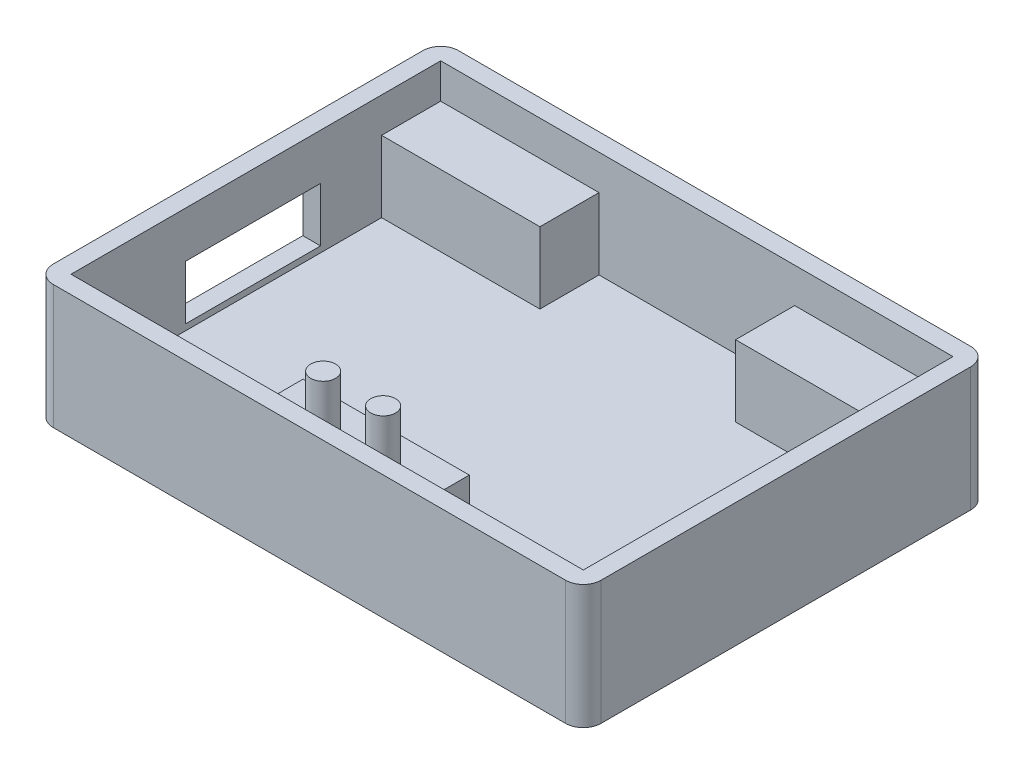
ISO-10303-21;
HEADER;
FILE_DESCRIPTION(('STEP AP214'),'2;1');
FILE_NAME('part.step','',(''),(''),'','','');
FILE_SCHEMA(('AUTOMOTIVE_DESIGN { 1 0 10303 214 1 1 1 1 }'));
ENDSEC;
DATA;
#1=APPLICATION_CONTEXT('core data for automotive mechanical design processes');
#2=APPLICATION_PROTOCOL_DEFINITION('international standard','automotive_design',2000,#1);
#3=PRODUCT_CONTEXT('',#1,'mechanical');
#4=PRODUCT('Part','Part','',(#3));
#5=PRODUCT_RELATED_PRODUCT_CATEGORY('part','',(#4));
#6=PRODUCT_DEFINITION_FORMATION('','',#4);
#7=PRODUCT_DEFINITION_CONTEXT('part definition',#1,'design');
#8=PRODUCT_DEFINITION('design','',#6,#7);
#9=PRODUCT_DEFINITION_SHAPE('','',#8);
#10=(LENGTH_UNIT() NAMED_UNIT(*) SI_UNIT(.MILLI.,.METRE.));
#11=(NAMED_UNIT(*) PLANE_ANGLE_UNIT() SI_UNIT($,.RADIAN.));
#12=(NAMED_UNIT(*) SI_UNIT($,.STERADIAN.) SOLID_ANGLE_UNIT());
#13=UNCERTAINTY_MEASURE_WITH_UNIT(LENGTH_MEASURE(1.E-05),#10,'distance_accuracy_value','');
#14=(GEOMETRIC_REPRESENTATION_CONTEXT(3) GLOBAL_UNCERTAINTY_ASSIGNED_CONTEXT((#13)) GLOBAL_UNIT_ASSIGNED_CONTEXT((#10,
#11,#12)) REPRESENTATION_CONTEXT('',''));
#15=CARTESIAN_POINT('',(0.,0.,0.));
#16=DIRECTION('',(0.,0.,1.));
#17=DIRECTION('',(1.,0.,0.));
#18=AXIS2_PLACEMENT_3D('',#15,#16,#17);
#19=CARTESIAN_POINT('',(0.,17.78,26.7452691548168));
#20=DIRECTION('',(0.,0.,-1.));
#21=DIRECTION('',(-1.,0.,0.));
#22=AXIS2_PLACEMENT_3D('',#19,#20,#21);
#23=PLANE('',#22);
#24=DIRECTION('',(1.,0.,0.));
#25=VECTOR('',#24,1.);
#26=CARTESIAN_POINT('',(0.,2.54,26.7452691548168));
#27=LINE('',#26,#25);
#28=CARTESIAN_POINT('',(11.6490516093158,2.54,26.7452691548168));
#29=VERTEX_POINT('',#28);
#30=CARTESIAN_POINT('',(36.6268923380733,2.54,26.7452691548168));
#31=VERTEX_POINT('',#30);
#32=EDGE_CURVE('E505',#29,#31,#27,.T.);
#33=ORIENTED_EDGE('',*,*,#32,.F.);
#34=DIRECTION('',(0.,-1.,0.));
#35=VECTOR('',#34,1.);
#36=CARTESIAN_POINT('',(11.6490516093158,12.7635,26.7452691548168));
#37=LINE('',#36,#35);
#38=CARTESIAN_POINT('',(11.6490516093158,12.7635,26.7452691548168));
#39=VERTEX_POINT('',#38);
#40=EDGE_CURVE('E358',#39,#29,#37,.T.);
#41=ORIENTED_EDGE('',*,*,#40,.F.);
#42=DIRECTION('',(1.,0.,0.));
#43=VECTOR('',#42,1.);
#44=CARTESIAN_POINT('',(0.,12.7635,26.7452691548168));
#45=LINE('',#44,#43);
#46=CARTESIAN_POINT('',(-12.1761728281339,12.7635,26.7452691548168));
#47=VERTEX_POINT('',#46);
#48=EDGE_CURVE('E384',#47,#39,#45,.T.);
#49=ORIENTED_EDGE('',*,*,#48,.F.);
#50=DIRECTION('',(0.,-1.,0.));
#51=VECTOR('',#50,1.);
#52=CARTESIAN_POINT('',(-12.1761728281339,12.7635,26.7452691548168));
#53=LINE('',#52,#51);
#54=CARTESIAN_POINT('',(-12.1761728281339,2.54,26.7452691548168));
#55=VERTEX_POINT('',#54);
#56=EDGE_CURVE('E370',#47,#55,#53,.T.);
#57=ORIENTED_EDGE('',*,*,#56,.T.);
#58=CARTESIAN_POINT('',(-36.8231076619268,2.54,26.7452691548168));
#59=VERTEX_POINT('',#58);
#60=EDGE_CURVE('E509',#59,#55,#27,.T.);
#61=ORIENTED_EDGE('',*,*,#60,.F.);
#62=DIRECTION('',(0.,-1.,0.));
#63=VECTOR('',#62,1.);
#64=CARTESIAN_POINT('',(-36.8231076619268,17.78,26.7452691548168));
#65=LINE('',#64,#63);
#66=CARTESIAN_POINT('',(-36.8231076619268,17.78,26.7452691548168));
#67=VERTEX_POINT('',#66);
#68=EDGE_CURVE('E493',#67,#59,#65,.T.);
#69=ORIENTED_EDGE('',*,*,#68,.F.);
#70=DIRECTION('',(1.,0.,0.));
#71=VECTOR('',#70,1.);
#72=CARTESIAN_POINT('',(0.,17.78,26.7452691548168));
#73=LINE('',#72,#71);
#74=CARTESIAN_POINT('',(36.6268923380733,17.78,26.7452691548168));
#75=VERTEX_POINT('',#74);
#76=EDGE_CURVE('E445',#67,#75,#73,.T.);
#77=ORIENTED_EDGE('',*,*,#76,.T.);
#78=DIRECTION('',(0.,-1.,0.));
#79=VECTOR('',#78,1.);
#80=CARTESIAN_POINT('',(36.6268923380733,17.78,26.7452691548168));
#81=LINE('',#80,#79);
#82=EDGE_CURVE('E497',#75,#31,#81,.T.);
#83=ORIENTED_EDGE('',*,*,#82,.T.);
#84=EDGE_LOOP('',(#33,#41,#49,#57,#61,#69,#77,#83));
#85=FACE_BOUND('',#84,.T.);
#86=ADVANCED_FACE('F118',(#85),#23,.T.);
#87=CARTESIAN_POINT('',(-36.8231076619268,17.78,0.));
#88=DIRECTION('',(1.,0.,0.));
#89=DIRECTION('',(0.,0.,-1.));
#90=AXIS2_PLACEMENT_3D('',#87,#88,#89);
#91=PLANE('',#90);
#92=DIRECTION('',(0.,0.,1.));
#93=VECTOR('',#92,1.);
#94=CARTESIAN_POINT('',(-36.8231076619268,3.40818597245117,0.));
#95=LINE('',#94,#93);
#96=CARTESIAN_POINT('',(-36.8231076619268,3.40818597245117,-9.032806342687));
#97=VERTEX_POINT('',#96);
#98=CARTESIAN_POINT('',(-36.8231076619268,3.40818597245117,10.3140443127063));
#99=VERTEX_POINT('',#98);
#100=EDGE_CURVE('E298',#97,#99,#95,.T.);
#101=ORIENTED_EDGE('',*,*,#100,.T.);
#102=DIRECTION('',(0.,1.,0.));
#103=VECTOR('',#102,1.);
#104=CARTESIAN_POINT('',(-36.8231076619268,0.,10.3140443127063));
#105=LINE('',#104,#103);
#106=CARTESIAN_POINT('',(-36.8231076619268,11.1723826170498,10.3140443127063));
#107=VERTEX_POINT('',#106);
#108=EDGE_CURVE('E310',#99,#107,#105,.T.);
#109=ORIENTED_EDGE('',*,*,#108,.T.);
#110=DIRECTION('',(0.,0.,1.));
#111=VECTOR('',#110,1.);
#112=CARTESIAN_POINT('',(-36.8231076619268,11.1723826170498,0.));
#113=LINE('',#112,#111);
#114=CARTESIAN_POINT('',(-36.8231076619268,11.1723826170498,-9.032806342687));
#115=VERTEX_POINT('',#114);
#116=EDGE_CURVE('E316',#115,#107,#113,.T.);
#117=ORIENTED_EDGE('',*,*,#116,.F.);
#118=DIRECTION('',(0.,1.,0.));
#119=VECTOR('',#118,1.);
#120=CARTESIAN_POINT('',(-36.8231076619268,0.,-9.032806342687));
#121=LINE('',#120,#119);
#122=EDGE_CURVE('E307',#97,#115,#121,.T.);
#123=ORIENTED_EDGE('',*,*,#122,.F.);
#124=EDGE_LOOP('',(#101,#109,#117,#123));
#125=FACE_BOUND('',#124,.T.);
#126=DIRECTION('',(0.,0.,1.));
#127=VECTOR('',#126,1.);
#128=CARTESIAN_POINT('',(-36.8231076619268,2.54,0.));
#129=LINE('',#128,#127);
#130=CARTESIAN_POINT('',(-36.8231076619268,2.54,-17.781990439612));
#131=VERTEX_POINT('',#130);
#132=EDGE_CURVE('E531',#131,#59,#129,.T.);
#133=ORIENTED_EDGE('',*,*,#132,.F.);
#134=DIRECTION('',(0.,-1.,0.));
#135=VECTOR('',#134,1.);
#136=CARTESIAN_POINT('',(-36.8231076619268,12.7635,-17.781990439612));
#137=LINE('',#136,#135);
#138=CARTESIAN_POINT('',(-36.8231076619268,12.7635,-17.781990439612));
#139=VERTEX_POINT('',#138);
#140=EDGE_CURVE('E391',#139,#131,#137,.T.);
#141=ORIENTED_EDGE('',*,*,#140,.F.);
#142=DIRECTION('',(0.,0.,1.));
#143=VECTOR('',#142,1.);
#144=CARTESIAN_POINT('',(-36.8231076619268,12.7635,0.));
#145=LINE('',#144,#143);
#146=CARTESIAN_POINT('',(-36.8231076619268,12.7635,-26.2547308451831));
#147=VERTEX_POINT('',#146);
#148=EDGE_CURVE('E402',#147,#139,#145,.T.);
#149=ORIENTED_EDGE('',*,*,#148,.F.);
#150=DIRECTION('',(0.,-1.,0.));
#151=VECTOR('',#150,1.);
#152=CARTESIAN_POINT('',(-36.8231076619268,17.78,-26.2547308451831));
#153=LINE('',#152,#151);
#154=CARTESIAN_POINT('',(-36.8231076619268,17.78,-26.2547308451831));
#155=VERTEX_POINT('',#154);
#156=EDGE_CURVE('E489',#155,#147,#153,.T.);
#157=ORIENTED_EDGE('',*,*,#156,.F.);
#158=DIRECTION('',(0.,0.,1.));
#159=VECTOR('',#158,1.);
#160=CARTESIAN_POINT('',(-36.8231076619268,17.78,0.));
#161=LINE('',#160,#159);
#162=EDGE_CURVE('E450',#155,#67,#161,.T.);
#163=ORIENTED_EDGE('',*,*,#162,.T.);
#164=ORIENTED_EDGE('',*,*,#68,.T.);
#165=EDGE_LOOP('',(#133,#141,#149,#157,#163,#164));
#166=FACE_BOUND('',#165,.T.);
#167=ADVANCED_FACE('F318',(#125,#166),#91,.T.);
#168=CARTESIAN_POINT('',(0.,17.78,-26.2547308451831));
#169=DIRECTION('',(0.,0.,1.));
#170=DIRECTION('',(1.,0.,0.));
#171=AXIS2_PLACEMENT_3D('',#168,#169,#170);
#172=PLANE('',#171);
#173=DIRECTION('',(0.,-1.,0.));
#174=VECTOR('',#173,1.);
#175=CARTESIAN_POINT('',(-14.1240900671385,12.7635,-26.2547308451831));
#176=LINE('',#175,#174);
#177=CARTESIAN_POINT('',(-14.1240900671385,12.7635,-26.2547308451831));
#178=VERTEX_POINT('',#177);
#179=CARTESIAN_POINT('',(-14.1240900671385,2.54,-26.2547308451831));
#180=VERTEX_POINT('',#179);
#181=EDGE_CURVE('E388',#178,#180,#176,.T.);
#182=ORIENTED_EDGE('',*,*,#181,.T.);
#183=DIRECTION('',(-1.,0.,0.));
#184=VECTOR('',#183,1.);
#185=CARTESIAN_POINT('',(0.,2.54,-26.2547308451831));
#186=LINE('',#185,#184);
#187=CARTESIAN_POINT('',(13.927874743285,2.54,-26.2547308451831));
#188=VERTEX_POINT('',#187);
#189=EDGE_CURVE('E520',#188,#180,#186,.T.);
#190=ORIENTED_EDGE('',*,*,#189,.F.);
#191=DIRECTION('',(0.,-1.,0.));
#192=VECTOR('',#191,1.);
#193=CARTESIAN_POINT('',(13.927874743285,12.7635,-26.2547308451831));
#194=LINE('',#193,#192);
#195=CARTESIAN_POINT('',(13.927874743285,12.7635,-26.2547308451831));
#196=VERTEX_POINT('',#195);
#197=EDGE_CURVE('E436',#196,#188,#194,.T.);
#198=ORIENTED_EDGE('',*,*,#197,.F.);
#199=DIRECTION('',(-1.,0.,0.));
#200=VECTOR('',#199,1.);
#201=CARTESIAN_POINT('',(0.,12.7635,-26.2547308451831));
#202=LINE('',#201,#200);
#203=CARTESIAN_POINT('',(36.6268923380733,12.7635,-26.2547308451831));
#204=VERTEX_POINT('',#203);
#205=EDGE_CURVE('E414',#204,#196,#202,.T.);
#206=ORIENTED_EDGE('',*,*,#205,.F.);
#207=DIRECTION('',(0.,-1.,0.));
#208=VECTOR('',#207,1.);
#209=CARTESIAN_POINT('',(36.6268923380733,17.78,-26.2547308451831));
#210=LINE('',#209,#208);
#211=CARTESIAN_POINT('',(36.6268923380733,17.78,-26.2547308451831));
#212=VERTEX_POINT('',#211);
#213=EDGE_CURVE('E472',#212,#204,#210,.T.);
#214=ORIENTED_EDGE('',*,*,#213,.F.);
#215=DIRECTION('',(-1.,0.,0.));
#216=VECTOR('',#215,1.);
#217=CARTESIAN_POINT('',(0.,17.78,-26.2547308451831));
#218=LINE('',#217,#216);
#219=EDGE_CURVE('E454',#212,#155,#218,.T.);
#220=ORIENTED_EDGE('',*,*,#219,.T.);
#221=ORIENTED_EDGE('',*,*,#156,.T.);
#222=DIRECTION('',(-1.,0.,0.));
#223=VECTOR('',#222,1.);
#224=CARTESIAN_POINT('',(0.,12.7635,-26.2547308451831));
#225=LINE('',#224,#223);
#226=EDGE_CURVE('E406',#178,#147,#225,.T.);
#227=ORIENTED_EDGE('',*,*,#226,.F.);
#228=EDGE_LOOP('',(#182,#190,#198,#206,#214,#220,#221,#227));
#229=FACE_BOUND('',#228,.T.);
#230=ADVANCED_FACE('F636',(#229),#172,.T.);
#231=CARTESIAN_POINT('',(0.,2.54,0.));
#232=DIRECTION('',(0.,1.,0.));
#233=DIRECTION('',(0.,0.,1.));
#234=AXIS2_PLACEMENT_3D('',#231,#232,#233);
#235=PLANE('',#234);
#236=DIRECTION('',(0.,0.,-1.));
#237=VECTOR('',#236,1.);
#238=CARTESIAN_POINT('',(11.6490516093158,2.54,0.));
#239=LINE('',#238,#237);
#240=CARTESIAN_POINT('',(11.6490516093158,2.54,18.1141874829041));
#241=VERTEX_POINT('',#240);
#242=EDGE_CURVE('E501',#29,#241,#239,.T.);
#243=ORIENTED_EDGE('',*,*,#242,.F.);
#244=ORIENTED_EDGE('',*,*,#32,.T.);
#245=DIRECTION('',(0.,0.,-1.));
#246=VECTOR('',#245,1.);
#247=CARTESIAN_POINT('',(36.6268923380733,2.54,0.));
#248=LINE('',#247,#246);
#249=CARTESIAN_POINT('',(36.6268923380733,2.54,-17.781990439612));
#250=VERTEX_POINT('',#249);
#251=EDGE_CURVE('E508',#31,#250,#248,.T.);
#252=ORIENTED_EDGE('',*,*,#251,.T.);
#253=DIRECTION('',(-1.,0.,0.));
#254=VECTOR('',#253,1.);
#255=CARTESIAN_POINT('',(0.,2.54,-17.7819904396119));
#256=LINE('',#255,#254);
#257=CARTESIAN_POINT('',(13.927874743285,2.54,-17.781990439612));
#258=VERTEX_POINT('',#257);
#259=EDGE_CURVE('E513',#250,#258,#256,.T.);
#260=ORIENTED_EDGE('',*,*,#259,.T.);
#261=DIRECTION('',(0.,0.,1.));
#262=VECTOR('',#261,1.);
#263=CARTESIAN_POINT('',(13.927874743285,2.54,0.));
#264=LINE('',#263,#262);
#265=EDGE_CURVE('E516',#188,#258,#264,.T.);
#266=ORIENTED_EDGE('',*,*,#265,.F.);
#267=ORIENTED_EDGE('',*,*,#189,.T.);
#268=DIRECTION('',(0.,0.,1.));
#269=VECTOR('',#268,1.);
#270=CARTESIAN_POINT('',(-14.1240900671385,2.54,0.));
#271=LINE('',#270,#269);
#272=CARTESIAN_POINT('',(-14.1240900671385,2.54,-17.781990439612));
#273=VERTEX_POINT('',#272);
#274=EDGE_CURVE('E524',#180,#273,#271,.T.);
#275=ORIENTED_EDGE('',*,*,#274,.T.);
#276=DIRECTION('',(1.,0.,0.));
#277=VECTOR('',#276,1.);
#278=CARTESIAN_POINT('',(0.,2.54,-17.781990439612));
#279=LINE('',#278,#277);
#280=EDGE_CURVE('E527',#131,#273,#279,.T.);
#281=ORIENTED_EDGE('',*,*,#280,.F.);
#282=ORIENTED_EDGE('',*,*,#132,.T.);
#283=ORIENTED_EDGE('',*,*,#60,.T.);
#284=DIRECTION('',(0.,0.,-1.));
#285=VECTOR('',#284,1.);
#286=CARTESIAN_POINT('',(-12.1761728281339,2.54,0.));
#287=LINE('',#286,#285);
#288=CARTESIAN_POINT('',(-12.1761728281339,2.54,18.1141874829041));
#289=VERTEX_POINT('',#288);
#290=EDGE_CURVE('E534',#55,#289,#287,.T.);
#291=ORIENTED_EDGE('',*,*,#290,.T.);
#292=DIRECTION('',(1.,0.,0.));
#293=VECTOR('',#292,1.);
#294=CARTESIAN_POINT('',(0.,2.54,18.1141874829041));
#295=LINE('',#294,#293);
#296=EDGE_CURVE('E537',#289,#241,#295,.T.);
#297=ORIENTED_EDGE('',*,*,#296,.T.);
#298=EDGE_LOOP('',(#243,#244,#252,#260,#266,#267,#275,#281,#282,#283,#291,#297));
#299=FACE_BOUND('',#298,.T.);
#300=ADVANCED_FACE('F645',(#299),#235,.T.);
#301=CARTESIAN_POINT('',(0.,0.,0.));
#302=DIRECTION('',(0.,1.,0.));
#303=DIRECTION('',(0.,0.,1.));
#304=AXIS2_PLACEMENT_3D('',#301,#302,#303);
#305=PLANE('',#304);
#306=DIRECTION('',(-1.,0.,0.));
#307=VECTOR('',#306,1.);
#308=CARTESIAN_POINT('',(0.,0.,-28.7947308451831));
#309=LINE('',#308,#307);
#310=CARTESIAN_POINT('',(36.6268923380733,0.,-28.7947308451831));
#311=VERTEX_POINT('',#310);
#312=CARTESIAN_POINT('',(-36.8231076619268,0.,-28.7947308451831));
#313=VERTEX_POINT('',#312);
#314=EDGE_CURVE('E480',#311,#313,#309,.T.);
#315=ORIENTED_EDGE('',*,*,#314,.F.);
#316=CARTESIAN_POINT('',(36.6268923380733,0.,-26.2547308451831));
#317=DIRECTION('',(0.,1.,0.));
#318=DIRECTION('',(0.,0.,1.));
#319=AXIS2_PLACEMENT_3D('',#316,#317,#318);
#320=CIRCLE('',#319,2.54);
#321=CARTESIAN_POINT('',(39.1668923380733,0.,-26.2547308451831));
#322=VERTEX_POINT('',#321);
#323=EDGE_CURVE('E562',#311,#322,#320,.F.);
#324=ORIENTED_EDGE('',*,*,#323,.T.);
#325=DIRECTION('',(0.,0.,-1.));
#326=VECTOR('',#325,1.);
#327=CARTESIAN_POINT('',(39.1668923380733,0.,0.));
#328=LINE('',#327,#326);
#329=CARTESIAN_POINT('',(39.1668923380733,0.,26.7452691548168));
#330=VERTEX_POINT('',#329);
#331=EDGE_CURVE('E476',#330,#322,#328,.T.);
#332=ORIENTED_EDGE('',*,*,#331,.F.);
#333=CARTESIAN_POINT('',(36.6268923380733,0.,26.7452691548168));
#334=DIRECTION('',(0.,1.,0.));
#335=DIRECTION('',(0.,0.,1.));
#336=AXIS2_PLACEMENT_3D('',#333,#334,#335);
#337=CIRCLE('',#336,2.54);
#338=CARTESIAN_POINT('',(36.6268923380733,0.,29.2852691548168));
#339=VERTEX_POINT('',#338);
#340=EDGE_CURVE('E553',#330,#339,#337,.F.);
#341=ORIENTED_EDGE('',*,*,#340,.T.);
#342=DIRECTION('',(1.,0.,0.));
#343=VECTOR('',#342,1.);
#344=CARTESIAN_POINT('',(0.,0.,29.2852691548168));
#345=LINE('',#344,#343);
#346=CARTESIAN_POINT('',(-36.8231076619268,0.,29.2852691548168));
#347=VERTEX_POINT('',#346);
#348=EDGE_CURVE('E440',#347,#339,#345,.T.);
#349=ORIENTED_EDGE('',*,*,#348,.F.);
#350=CARTESIAN_POINT('',(-36.8231076619268,0.,26.7452691548168));
#351=DIRECTION('',(0.,1.,0.));
#352=DIRECTION('',(0.,0.,1.));
#353=AXIS2_PLACEMENT_3D('',#350,#351,#352);
#354=CIRCLE('',#353,2.54);
#355=CARTESIAN_POINT('',(-39.3631076619268,0.,26.7452691548168));
#356=VERTEX_POINT('',#355);
#357=EDGE_CURVE('E556',#347,#356,#354,.F.);
#358=ORIENTED_EDGE('',*,*,#357,.T.);
#359=DIRECTION('',(0.,0.,1.));
#360=VECTOR('',#359,1.);
#361=CARTESIAN_POINT('',(-39.3631076619268,0.,0.));
#362=LINE('',#361,#360);
#363=CARTESIAN_POINT('',(-39.3631076619268,0.,-26.2547308451831));
#364=VERTEX_POINT('',#363);
#365=EDGE_CURVE('E446',#364,#356,#362,.T.);
#366=ORIENTED_EDGE('',*,*,#365,.F.);
#367=CARTESIAN_POINT('',(-36.8231076619268,0.,-26.2547308451831));
#368=DIRECTION('',(0.,1.,0.));
#369=DIRECTION('',(0.,0.,1.));
#370=AXIS2_PLACEMENT_3D('',#367,#368,#369);
#371=CIRCLE('',#370,2.54);
#372=EDGE_CURVE('E559',#364,#313,#371,.F.);
#373=ORIENTED_EDGE('',*,*,#372,.T.);
#374=EDGE_LOOP('',(#315,#324,#332,#341,#349,#358,#366,#373));
#375=FACE_BOUND('',#374,.T.);
#376=ADVANCED_FACE('F607',(#375),#305,.F.);
#377=CARTESIAN_POINT('',(36.6268923380733,17.78,0.));
#378=DIRECTION('',(-1.,0.,0.));
#379=DIRECTION('',(0.,0.,1.));
#380=AXIS2_PLACEMENT_3D('',#377,#378,#379);
#381=PLANE('',#380);
#382=DIRECTION('',(0.,-1.,0.));
#383=VECTOR('',#382,1.);
#384=CARTESIAN_POINT('',(36.6268923380733,12.7635,-17.781990439612));
#385=LINE('',#384,#383);
#386=CARTESIAN_POINT('',(36.6268923380733,12.7635,-17.781990439612));
#387=VERTEX_POINT('',#386);
#388=EDGE_CURVE('E429',#387,#250,#385,.T.);
#389=ORIENTED_EDGE('',*,*,#388,.T.);
#390=ORIENTED_EDGE('',*,*,#251,.F.);
#391=ORIENTED_EDGE('',*,*,#82,.F.);
#392=DIRECTION('',(0.,0.,-1.));
#393=VECTOR('',#392,1.);
#394=CARTESIAN_POINT('',(36.6268923380733,17.78,0.));
#395=LINE('',#394,#393);
#396=EDGE_CURVE('E441',#75,#212,#395,.T.);
#397=ORIENTED_EDGE('',*,*,#396,.T.);
#398=ORIENTED_EDGE('',*,*,#213,.T.);
#399=DIRECTION('',(0.,0.,-1.));
#400=VECTOR('',#399,1.);
#401=CARTESIAN_POINT('',(36.6268923380733,12.7635,0.));
#402=LINE('',#401,#400);
#403=EDGE_CURVE('E425',#387,#204,#402,.T.);
#404=ORIENTED_EDGE('',*,*,#403,.F.);
#405=EDGE_LOOP('',(#389,#390,#391,#397,#398,#404));
#406=FACE_BOUND('',#405,.T.);
#407=ADVANCED_FACE('F641',(#406),#381,.T.);
#408=CARTESIAN_POINT('',(0.,17.78,29.2852691548168));
#409=DIRECTION('',(0.,0.,-1.));
#410=DIRECTION('',(-1.,0.,0.));
#411=AXIS2_PLACEMENT_3D('',#408,#409,#410);
#412=PLANE('',#411);
#413=DIRECTION('',(1.,0.,0.));
#414=VECTOR('',#413,1.);
#415=CARTESIAN_POINT('',(0.,17.78,29.2852691548168));
#416=LINE('',#415,#414);
#417=CARTESIAN_POINT('',(-36.8231076619268,17.78,29.2852691548168));
#418=VERTEX_POINT('',#417);
#419=CARTESIAN_POINT('',(36.6268923380733,17.78,29.2852691548168));
#420=VERTEX_POINT('',#419);
#421=EDGE_CURVE('E458',#418,#420,#416,.T.);
#422=ORIENTED_EDGE('',*,*,#421,.F.);
#423=DIRECTION('',(0.,-1.,0.));
#424=VECTOR('',#423,1.);
#425=CARTESIAN_POINT('',(-36.8231076619268,17.78,29.2852691548168));
#426=LINE('',#425,#424);
#427=EDGE_CURVE('E12',#418,#347,#426,.T.);
#428=ORIENTED_EDGE('',*,*,#427,.T.);
#429=ORIENTED_EDGE('',*,*,#348,.T.);
#430=DIRECTION('',(0.,-1.,0.));
#431=VECTOR('',#430,1.);
#432=CARTESIAN_POINT('',(36.6268923380733,17.78,29.2852691548168));
#433=LINE('',#432,#431);
#434=EDGE_CURVE('E127',#339,#420,#433,.F.);
#435=ORIENTED_EDGE('',*,*,#434,.T.);
#436=EDGE_LOOP('',(#422,#428,#429,#435));
#437=FACE_BOUND('',#436,.T.);
#438=ADVANCED_FACE('F592',(#437),#412,.F.);
#439=CARTESIAN_POINT('',(39.1668923380733,17.78,0.));
#440=DIRECTION('',(-1.,0.,0.));
#441=DIRECTION('',(0.,0.,1.));
#442=AXIS2_PLACEMENT_3D('',#439,#440,#441);
#443=PLANE('',#442);
#444=ORIENTED_EDGE('',*,*,#331,.T.);
#445=DIRECTION('',(0.,-1.,0.));
#446=VECTOR('',#445,1.);
#447=CARTESIAN_POINT('',(39.1668923380733,17.78,-26.2547308451831));
#448=LINE('',#447,#446);
#449=CARTESIAN_POINT('',(39.1668923380733,17.78,-26.2547308451831));
#450=VERTEX_POINT('',#449);
#451=EDGE_CURVE('E569',#322,#450,#448,.F.);
#452=ORIENTED_EDGE('',*,*,#451,.T.);
#453=DIRECTION('',(0.,0.,-1.));
#454=VECTOR('',#453,1.);
#455=CARTESIAN_POINT('',(39.1668923380733,17.78,0.));
#456=LINE('',#455,#454);
#457=CARTESIAN_POINT('',(39.1668923380733,17.78,26.7452691548168));
#458=VERTEX_POINT('',#457);
#459=EDGE_CURVE('E462',#458,#450,#456,.T.);
#460=ORIENTED_EDGE('',*,*,#459,.F.);
#461=DIRECTION('',(0.,-1.,0.));
#462=VECTOR('',#461,1.);
#463=CARTESIAN_POINT('',(39.1668923380733,17.78,26.7452691548168));
#464=LINE('',#463,#462);
#465=EDGE_CURVE('E565',#458,#330,#464,.T.);
#466=ORIENTED_EDGE('',*,*,#465,.T.);
#467=EDGE_LOOP('',(#444,#452,#460,#466));
#468=FACE_BOUND('',#467,.T.);
#469=ADVANCED_FACE('F603',(#468),#443,.F.);
#470=CARTESIAN_POINT('',(0.,17.78,-28.7947308451831));
#471=DIRECTION('',(0.,0.,1.));
#472=DIRECTION('',(1.,0.,0.));
#473=AXIS2_PLACEMENT_3D('',#470,#471,#472);
#474=PLANE('',#473);
#475=DIRECTION('',(-1.,0.,0.));
#476=VECTOR('',#475,1.);
#477=CARTESIAN_POINT('',(0.,17.78,-28.7947308451831));
#478=LINE('',#477,#476);
#479=CARTESIAN_POINT('',(36.6268923380733,17.78,-28.7947308451831));
#480=VERTEX_POINT('',#479);
#481=CARTESIAN_POINT('',(-36.8231076619268,17.78,-28.7947308451831));
#482=VERTEX_POINT('',#481);
#483=EDGE_CURVE('E466',#480,#482,#478,.T.);
#484=ORIENTED_EDGE('',*,*,#483,.F.);
#485=DIRECTION('',(0.,-1.,0.));
#486=VECTOR('',#485,1.);
#487=CARTESIAN_POINT('',(36.6268923380733,17.78,-28.7947308451831));
#488=LINE('',#487,#486);
#489=EDGE_CURVE('E549',#480,#311,#488,.T.);
#490=ORIENTED_EDGE('',*,*,#489,.T.);
#491=ORIENTED_EDGE('',*,*,#314,.T.);
#492=DIRECTION('',(0.,-1.,0.));
#493=VECTOR('',#492,1.);
#494=CARTESIAN_POINT('',(-36.8231076619268,17.78,-28.7947308451831));
#495=LINE('',#494,#493);
#496=EDGE_CURVE('E540',#313,#482,#495,.F.);
#497=ORIENTED_EDGE('',*,*,#496,.T.);
#498=EDGE_LOOP('',(#484,#490,#491,#497));
#499=FACE_BOUND('',#498,.T.);
#500=ADVANCED_FACE('F614',(#499),#474,.F.);
#501=CARTESIAN_POINT('',(-39.3631076619268,17.78,0.));
#502=DIRECTION('',(1.,0.,0.));
#503=DIRECTION('',(0.,0.,-1.));
#504=AXIS2_PLACEMENT_3D('',#501,#502,#503);
#505=PLANE('',#504);
#506=DIRECTION('',(0.,1.,0.));
#507=VECTOR('',#506,1.);
#508=CARTESIAN_POINT('',(-39.3631076619268,0.,10.3140443127063));
#509=LINE('',#508,#507);
#510=CARTESIAN_POINT('',(-39.3631076619268,3.40818597245117,10.3140443127063));
#511=VERTEX_POINT('',#510);
#512=CARTESIAN_POINT('',(-39.3631076619268,11.1723826170498,10.3140443127063));
#513=VERTEX_POINT('',#512);
#514=EDGE_CURVE('E334',#511,#513,#509,.T.);
#515=ORIENTED_EDGE('',*,*,#514,.F.);
#516=DIRECTION('',(0.,0.,1.));
#517=VECTOR('',#516,1.);
#518=CARTESIAN_POINT('',(-39.3631076619268,3.40818597245117,0.));
#519=LINE('',#518,#517);
#520=CARTESIAN_POINT('',(-39.3631076619268,3.40818597245117,-9.032806342687));
#521=VERTEX_POINT('',#520);
#522=EDGE_CURVE('E301',#521,#511,#519,.T.);
#523=ORIENTED_EDGE('',*,*,#522,.F.);
#524=DIRECTION('',(0.,1.,0.));
#525=VECTOR('',#524,1.);
#526=CARTESIAN_POINT('',(-39.3631076619268,0.,-9.032806342687));
#527=LINE('',#526,#525);
#528=CARTESIAN_POINT('',(-39.3631076619268,11.1723826170498,-9.032806342687));
#529=VERTEX_POINT('',#528);
#530=EDGE_CURVE('E321',#521,#529,#527,.T.);
#531=ORIENTED_EDGE('',*,*,#530,.T.);
#532=DIRECTION('',(0.,0.,1.));
#533=VECTOR('',#532,1.);
#534=CARTESIAN_POINT('',(-39.3631076619268,11.1723826170498,0.));
#535=LINE('',#534,#533);
#536=EDGE_CURVE('E325',#529,#513,#535,.T.);
#537=ORIENTED_EDGE('',*,*,#536,.T.);
#538=EDGE_LOOP('',(#515,#523,#531,#537));
#539=FACE_BOUND('',#538,.T.);
#540=DIRECTION('',(0.,0.,1.));
#541=VECTOR('',#540,1.);
#542=CARTESIAN_POINT('',(-39.3631076619268,17.78,0.));
#543=LINE('',#542,#541);
#544=CARTESIAN_POINT('',(-39.3631076619268,17.78,-26.2547308451831));
#545=VERTEX_POINT('',#544);
#546=CARTESIAN_POINT('',(-39.3631076619268,17.78,26.7452691548168));
#547=VERTEX_POINT('',#546);
#548=EDGE_CURVE('E469',#545,#547,#543,.T.);
#549=ORIENTED_EDGE('',*,*,#548,.F.);
#550=DIRECTION('',(0.,-1.,0.));
#551=VECTOR('',#550,1.);
#552=CARTESIAN_POINT('',(-39.3631076619268,17.78,-26.2547308451831));
#553=LINE('',#552,#551);
#554=EDGE_CURVE('E585',#545,#364,#553,.T.);
#555=ORIENTED_EDGE('',*,*,#554,.T.);
#556=ORIENTED_EDGE('',*,*,#365,.T.);
#557=DIRECTION('',(0.,-1.,0.));
#558=VECTOR('',#557,1.);
#559=CARTESIAN_POINT('',(-39.3631076619268,17.78,26.7452691548168));
#560=LINE('',#559,#558);
#561=EDGE_CURVE('E134',#356,#547,#560,.F.);
#562=ORIENTED_EDGE('',*,*,#561,.T.);
#563=EDGE_LOOP('',(#549,#555,#556,#562));
#564=FACE_BOUND('',#563,.T.);
#565=ADVANCED_FACE('F620',(#539,#564),#505,.F.);
#566=CARTESIAN_POINT('',(0.,17.78,0.));
#567=DIRECTION('',(0.,1.,0.));
#568=DIRECTION('',(0.,0.,1.));
#569=AXIS2_PLACEMENT_3D('',#566,#567,#568);
#570=PLANE('',#569);
#571=ORIENTED_EDGE('',*,*,#396,.F.);
#572=ORIENTED_EDGE('',*,*,#76,.F.);
#573=ORIENTED_EDGE('',*,*,#162,.F.);
#574=ORIENTED_EDGE('',*,*,#219,.F.);
#575=EDGE_LOOP('',(#571,#572,#573,#574));
#576=FACE_BOUND('',#575,.T.);
#577=ORIENTED_EDGE('',*,*,#459,.T.);
#578=CARTESIAN_POINT('',(36.6268923380733,17.78,-26.2547308451831));
#579=DIRECTION('',(0.,1.,0.));
#580=DIRECTION('',(0.,0.,1.));
#581=AXIS2_PLACEMENT_3D('',#578,#579,#580);
#582=CIRCLE('',#581,2.54);
#583=EDGE_CURVE('E580',#450,#480,#582,.T.);
#584=ORIENTED_EDGE('',*,*,#583,.T.);
#585=ORIENTED_EDGE('',*,*,#483,.T.);
#586=CARTESIAN_POINT('',(-36.8231076619268,17.78,-26.2547308451831));
#587=DIRECTION('',(0.,1.,0.));
#588=DIRECTION('',(0.,0.,1.));
#589=AXIS2_PLACEMENT_3D('',#586,#587,#588);
#590=CIRCLE('',#589,2.54);
#591=EDGE_CURVE('E141',#482,#545,#590,.T.);
#592=ORIENTED_EDGE('',*,*,#591,.T.);
#593=ORIENTED_EDGE('',*,*,#548,.T.);
#594=CARTESIAN_POINT('',(-36.8231076619268,17.78,26.7452691548168));
#595=DIRECTION('',(0.,1.,0.));
#596=DIRECTION('',(0.,0.,1.));
#597=AXIS2_PLACEMENT_3D('',#594,#595,#596);
#598=CIRCLE('',#597,2.54);
#599=EDGE_CURVE('E575',#547,#418,#598,.T.);
#600=ORIENTED_EDGE('',*,*,#599,.T.);
#601=ORIENTED_EDGE('',*,*,#421,.T.);
#602=CARTESIAN_POINT('',(36.6268923380733,17.78,26.7452691548168));
#603=DIRECTION('',(0.,1.,0.));
#604=DIRECTION('',(0.,0.,1.));
#605=AXIS2_PLACEMENT_3D('',#602,#603,#604);
#606=CIRCLE('',#605,2.54);
#607=EDGE_CURVE('E572',#420,#458,#606,.T.);
#608=ORIENTED_EDGE('',*,*,#607,.T.);
#609=EDGE_LOOP('',(#577,#584,#585,#592,#593,#600,#601,#608));
#610=FACE_BOUND('',#609,.T.);
#611=ADVANCED_FACE('F597',(#576,#610),#570,.T.);
#612=CARTESIAN_POINT('',(0.,12.7635,0.));
#613=DIRECTION('',(0.,1.,0.));
#614=DIRECTION('',(0.,0.,1.));
#615=AXIS2_PLACEMENT_3D('',#612,#613,#614);
#616=PLANE('',#615);
#617=ORIENTED_EDGE('',*,*,#205,.T.);
#618=DIRECTION('',(0.,0.,1.));
#619=VECTOR('',#618,1.);
#620=CARTESIAN_POINT('',(13.927874743285,12.7635,0.));
#621=LINE('',#620,#619);
#622=CARTESIAN_POINT('',(13.927874743285,12.7635,-17.781990439612));
#623=VERTEX_POINT('',#622);
#624=EDGE_CURVE('E418',#196,#623,#621,.T.);
#625=ORIENTED_EDGE('',*,*,#624,.T.);
#626=DIRECTION('',(-1.,0.,0.));
#627=VECTOR('',#626,1.);
#628=CARTESIAN_POINT('',(0.,12.7635,-17.7819904396119));
#629=LINE('',#628,#627);
#630=EDGE_CURVE('E421',#387,#623,#629,.T.);
#631=ORIENTED_EDGE('',*,*,#630,.F.);
#632=ORIENTED_EDGE('',*,*,#403,.T.);
#633=EDGE_LOOP('',(#617,#625,#631,#632));
#634=FACE_BOUND('',#633,.T.);
#635=ADVANCED_FACE('F713',(#634),#616,.T.);
#636=CARTESIAN_POINT('',(13.927874743285,12.7635,0.));
#637=DIRECTION('',(1.,0.,0.));
#638=DIRECTION('',(0.,0.,-1.));
#639=AXIS2_PLACEMENT_3D('',#636,#637,#638);
#640=PLANE('',#639);
#641=ORIENTED_EDGE('',*,*,#265,.T.);
#642=DIRECTION('',(0.,-1.,0.));
#643=VECTOR('',#642,1.);
#644=CARTESIAN_POINT('',(13.927874743285,12.7635,-17.781990439612));
#645=LINE('',#644,#643);
#646=EDGE_CURVE('E432',#623,#258,#645,.T.);
#647=ORIENTED_EDGE('',*,*,#646,.F.);
#648=ORIENTED_EDGE('',*,*,#624,.F.);
#649=ORIENTED_EDGE('',*,*,#197,.T.);
#650=EDGE_LOOP('',(#641,#647,#648,#649));
#651=FACE_BOUND('',#650,.T.);
#652=ADVANCED_FACE('F716',(#651),#640,.F.);
#653=CARTESIAN_POINT('',(0.,12.7635,-17.7819904396119));
#654=DIRECTION('',(0.,0.,1.));
#655=DIRECTION('',(1.,0.,0.));
#656=AXIS2_PLACEMENT_3D('',#653,#654,#655);
#657=PLANE('',#656);
#658=ORIENTED_EDGE('',*,*,#646,.T.);
#659=ORIENTED_EDGE('',*,*,#259,.F.);
#660=ORIENTED_EDGE('',*,*,#388,.F.);
#661=ORIENTED_EDGE('',*,*,#630,.T.);
#662=EDGE_LOOP('',(#658,#659,#660,#661));
#663=FACE_BOUND('',#662,.T.);
#664=ADVANCED_FACE('F711',(#663),#657,.T.);
#665=CARTESIAN_POINT('',(0.,12.7635,0.));
#666=DIRECTION('',(0.,1.,0.));
#667=DIRECTION('',(0.,0.,1.));
#668=AXIS2_PLACEMENT_3D('',#665,#666,#667);
#669=PLANE('',#668);
#670=DIRECTION('',(0.,0.,1.));
#671=VECTOR('',#670,1.);
#672=CARTESIAN_POINT('',(-14.1240900671385,12.7635,0.));
#673=LINE('',#672,#671);
#674=CARTESIAN_POINT('',(-14.1240900671385,12.7635,-17.781990439612));
#675=VERTEX_POINT('',#674);
#676=EDGE_CURVE('E410',#178,#675,#673,.T.);
#677=ORIENTED_EDGE('',*,*,#676,.F.);
#678=ORIENTED_EDGE('',*,*,#226,.T.);
#679=ORIENTED_EDGE('',*,*,#148,.T.);
#680=DIRECTION('',(1.,0.,0.));
#681=VECTOR('',#680,1.);
#682=CARTESIAN_POINT('',(0.,12.7635,-17.781990439612));
#683=LINE('',#682,#681);
#684=EDGE_CURVE('E399',#139,#675,#683,.T.);
#685=ORIENTED_EDGE('',*,*,#684,.T.);
#686=EDGE_LOOP('',(#677,#678,#679,#685));
#687=FACE_BOUND('',#686,.T.);
#688=ADVANCED_FACE('F704',(#687),#669,.T.);
#689=CARTESIAN_POINT('',(-14.1240900671385,12.7635,0.));
#690=DIRECTION('',(1.,0.,0.));
#691=DIRECTION('',(0.,0.,-1.));
#692=AXIS2_PLACEMENT_3D('',#689,#690,#691);
#693=PLANE('',#692);
#694=DIRECTION('',(0.,-1.,0.));
#695=VECTOR('',#694,1.);
#696=CARTESIAN_POINT('',(-14.1240900671385,12.7635,-17.781990439612));
#697=LINE('',#696,#695);
#698=EDGE_CURVE('E395',#675,#273,#697,.T.);
#699=ORIENTED_EDGE('',*,*,#698,.T.);
#700=ORIENTED_EDGE('',*,*,#274,.F.);
#701=ORIENTED_EDGE('',*,*,#181,.F.);
#702=ORIENTED_EDGE('',*,*,#676,.T.);
#703=EDGE_LOOP('',(#699,#700,#701,#702));
#704=FACE_BOUND('',#703,.T.);
#705=ADVANCED_FACE('F701',(#704),#693,.T.);
#706=CARTESIAN_POINT('',(0.,12.7635,-17.781990439612));
#707=DIRECTION('',(0.,0.,-1.));
#708=DIRECTION('',(-1.,0.,0.));
#709=AXIS2_PLACEMENT_3D('',#706,#707,#708);
#710=PLANE('',#709);
#711=ORIENTED_EDGE('',*,*,#280,.T.);
#712=ORIENTED_EDGE('',*,*,#698,.F.);
#713=ORIENTED_EDGE('',*,*,#684,.F.);
#714=ORIENTED_EDGE('',*,*,#140,.T.);
#715=EDGE_LOOP('',(#711,#712,#713,#714));
#716=FACE_BOUND('',#715,.T.);
#717=ADVANCED_FACE('F699',(#716),#710,.F.);
#718=CARTESIAN_POINT('',(0.,12.7635,0.));
#719=DIRECTION('',(0.,1.,0.));
#720=DIRECTION('',(0.,0.,1.));
#721=AXIS2_PLACEMENT_3D('',#718,#719,#720);
#722=PLANE('',#721);
#723=CARTESIAN_POINT('',(4.42878467614649,12.7635,23.24716149289));
#724=DIRECTION('',(0.,1.,0.));
#725=DIRECTION('',(0.,0.,1.));
#726=AXIS2_PLACEMENT_3D('',#723,#724,#725);
#727=CIRCLE('',#726,1.778);
#728=CARTESIAN_POINT('',(4.42878467614649,12.7635,25.02516149289));
#729=VERTEX_POINT('',#728);
#730=EDGE_CURVE('E352',#729,#729,#727,.F.);
#731=ORIENTED_EDGE('',*,*,#730,.T.);
#732=EDGE_LOOP('',(#731));
#733=FACE_BOUND('',#732,.T.);
#734=CARTESIAN_POINT('',(-4.17121532385345,12.7635,23.24716149289));
#735=DIRECTION('',(0.,1.,0.));
#736=DIRECTION('',(0.,0.,1.));
#737=AXIS2_PLACEMENT_3D('',#734,#735,#736);
#738=CIRCLE('',#737,1.778);
#739=CARTESIAN_POINT('',(-4.17121532385345,12.7635,25.02516149289));
#740=VERTEX_POINT('',#739);
#741=EDGE_CURVE('E357',#740,#740,#738,.F.);
#742=ORIENTED_EDGE('',*,*,#741,.T.);
#743=EDGE_LOOP('',(#742));
#744=FACE_BOUND('',#743,.T.);
#745=ORIENTED_EDGE('',*,*,#48,.T.);
#746=DIRECTION('',(0.,0.,-1.));
#747=VECTOR('',#746,1.);
#748=CARTESIAN_POINT('',(11.6490516093158,12.7635,0.));
#749=LINE('',#748,#747);
#750=CARTESIAN_POINT('',(11.6490516093158,12.7635,18.1141874829041));
#751=VERTEX_POINT('',#750);
#752=EDGE_CURVE('E381',#39,#751,#749,.T.);
#753=ORIENTED_EDGE('',*,*,#752,.T.);
#754=DIRECTION('',(1.,0.,0.));
#755=VECTOR('',#754,1.);
#756=CARTESIAN_POINT('',(0.,12.7635,18.1141874829041));
#757=LINE('',#756,#755);
#758=CARTESIAN_POINT('',(-12.1761728281339,12.7635,18.1141874829041));
#759=VERTEX_POINT('',#758);
#760=EDGE_CURVE('E377',#759,#751,#757,.T.);
#761=ORIENTED_EDGE('',*,*,#760,.F.);
#762=DIRECTION('',(0.,0.,-1.));
#763=VECTOR('',#762,1.);
#764=CARTESIAN_POINT('',(-12.1761728281339,12.7635,0.));
#765=LINE('',#764,#763);
#766=EDGE_CURVE('E373',#47,#759,#765,.T.);
#767=ORIENTED_EDGE('',*,*,#766,.F.);
#768=EDGE_LOOP('',(#745,#753,#761,#767));
#769=FACE_BOUND('',#768,.T.);
#770=ADVANCED_FACE('F695',(#733,#744,#769),#722,.T.);
#771=CARTESIAN_POINT('',(-12.1761728281339,12.7635,0.));
#772=DIRECTION('',(-1.,0.,0.));
#773=DIRECTION('',(0.,0.,1.));
#774=AXIS2_PLACEMENT_3D('',#771,#772,#773);
#775=PLANE('',#774);
#776=DIRECTION('',(0.,-1.,0.));
#777=VECTOR('',#776,1.);
#778=CARTESIAN_POINT('',(-12.1761728281339,12.7635,18.1141874829041));
#779=LINE('',#778,#777);
#780=EDGE_CURVE('E366',#759,#289,#779,.T.);
#781=ORIENTED_EDGE('',*,*,#780,.T.);
#782=ORIENTED_EDGE('',*,*,#290,.F.);
#783=ORIENTED_EDGE('',*,*,#56,.F.);
#784=ORIENTED_EDGE('',*,*,#766,.T.);
#785=EDGE_LOOP('',(#781,#782,#783,#784));
#786=FACE_BOUND('',#785,.T.);
#787=ADVANCED_FACE('F691',(#786),#775,.T.);
#788=CARTESIAN_POINT('',(0.,12.7635,18.1141874829041));
#789=DIRECTION('',(0.,0.,-1.));
#790=DIRECTION('',(-1.,0.,0.));
#791=AXIS2_PLACEMENT_3D('',#788,#789,#790);
#792=PLANE('',#791);
#793=DIRECTION('',(0.,-1.,0.));
#794=VECTOR('',#793,1.);
#795=CARTESIAN_POINT('',(11.6490516093158,12.7635,18.1141874829041));
#796=LINE('',#795,#794);
#797=EDGE_CURVE('E362',#751,#241,#796,.T.);
#798=ORIENTED_EDGE('',*,*,#797,.T.);
#799=ORIENTED_EDGE('',*,*,#296,.F.);
#800=ORIENTED_EDGE('',*,*,#780,.F.);
#801=ORIENTED_EDGE('',*,*,#760,.T.);
#802=EDGE_LOOP('',(#798,#799,#800,#801));
#803=FACE_BOUND('',#802,.T.);
#804=ADVANCED_FACE('F687',(#803),#792,.T.);
#805=CARTESIAN_POINT('',(11.6490516093158,12.7635,0.));
#806=DIRECTION('',(-1.,0.,0.));
#807=DIRECTION('',(0.,0.,1.));
#808=AXIS2_PLACEMENT_3D('',#805,#806,#807);
#809=PLANE('',#808);
#810=ORIENTED_EDGE('',*,*,#242,.T.);
#811=ORIENTED_EDGE('',*,*,#797,.F.);
#812=ORIENTED_EDGE('',*,*,#752,.F.);
#813=ORIENTED_EDGE('',*,*,#40,.T.);
#814=EDGE_LOOP('',(#810,#811,#812,#813));
#815=FACE_BOUND('',#814,.T.);
#816=ADVANCED_FACE('F683',(#815),#809,.F.);
#817=CARTESIAN_POINT('',(-4.17121532385345,20.32,23.24716149289));
#818=DIRECTION('',(0.,-1.,0.));
#819=DIRECTION('',(0.,0.,-1.));
#820=AXIS2_PLACEMENT_3D('',#817,#818,#819);
#821=CYLINDRICAL_SURFACE('',#820,1.778);
#822=ORIENTED_EDGE('',*,*,#741,.F.);
#823=EDGE_LOOP('',(#822));
#824=FACE_BOUND('',#823,.T.);
#825=CARTESIAN_POINT('',(-4.17121532385345,20.32,23.24716149289));
#826=DIRECTION('',(0.,1.,0.));
#827=DIRECTION('',(0.,0.,1.));
#828=AXIS2_PLACEMENT_3D('',#825,#826,#827);
#829=CIRCLE('',#828,1.778);
#830=CARTESIAN_POINT('',(-4.17121532385345,20.32,25.02516149289));
#831=VERTEX_POINT('',#830);
#832=EDGE_CURVE('E353',#831,#831,#829,.T.);
#833=ORIENTED_EDGE('',*,*,#832,.F.);
#834=EDGE_LOOP('',(#833));
#835=FACE_BOUND('',#834,.T.);
#836=ADVANCED_FACE('F679',(#824,#835),#821,.T.);
#837=CARTESIAN_POINT('',(0.,20.32,0.));
#838=DIRECTION('',(0.,1.,0.));
#839=DIRECTION('',(0.,0.,1.));
#840=AXIS2_PLACEMENT_3D('',#837,#838,#839);
#841=PLANE('',#840);
#842=ORIENTED_EDGE('',*,*,#832,.T.);
#843=EDGE_LOOP('',(#842));
#844=FACE_BOUND('',#843,.T.);
#845=ADVANCED_FACE('F675',(#844),#841,.T.);
#846=CARTESIAN_POINT('',(4.42878467614649,20.32,23.24716149289));
#847=DIRECTION('',(0.,-1.,0.));
#848=DIRECTION('',(0.,0.,-1.));
#849=AXIS2_PLACEMENT_3D('',#846,#847,#848);
#850=CYLINDRICAL_SURFACE('',#849,1.778);
#851=ORIENTED_EDGE('',*,*,#730,.F.);
#852=EDGE_LOOP('',(#851));
#853=FACE_BOUND('',#852,.T.);
#854=CARTESIAN_POINT('',(4.42878467614649,20.32,23.24716149289));
#855=DIRECTION('',(0.,1.,0.));
#856=DIRECTION('',(0.,0.,1.));
#857=AXIS2_PLACEMENT_3D('',#854,#855,#856);
#858=CIRCLE('',#857,1.778);
#859=CARTESIAN_POINT('',(4.42878467614649,20.32,25.02516149289));
#860=VERTEX_POINT('',#859);
#861=EDGE_CURVE('E343',#860,#860,#858,.T.);
#862=ORIENTED_EDGE('',*,*,#861,.F.);
#863=EDGE_LOOP('',(#862));
#864=FACE_BOUND('',#863,.T.);
#865=ADVANCED_FACE('F671',(#853,#864),#850,.T.);
#866=CARTESIAN_POINT('',(0.,20.32,0.));
#867=DIRECTION('',(0.,1.,0.));
#868=DIRECTION('',(0.,0.,1.));
#869=AXIS2_PLACEMENT_3D('',#866,#867,#868);
#870=PLANE('',#869);
#871=ORIENTED_EDGE('',*,*,#861,.T.);
#872=EDGE_LOOP('',(#871));
#873=FACE_BOUND('',#872,.T.);
#874=ADVANCED_FACE('F668',(#873),#870,.T.);
#875=CARTESIAN_POINT('',(-36.8231076619268,3.40818597245117,0.));
#876=DIRECTION('',(0.,-1.,0.));
#877=DIRECTION('',(0.,0.,-1.));
#878=AXIS2_PLACEMENT_3D('',#875,#876,#877);
#879=PLANE('',#878);
#880=ORIENTED_EDGE('',*,*,#522,.T.);
#881=DIRECTION('',(-1.,0.,0.));
#882=VECTOR('',#881,1.);
#883=CARTESIAN_POINT('',(-36.8231076619268,3.40818597245117,10.3140443127063));
#884=LINE('',#883,#882);
#885=EDGE_CURVE('E294',#99,#511,#884,.T.);
#886=ORIENTED_EDGE('',*,*,#885,.F.);
#887=ORIENTED_EDGE('',*,*,#100,.F.);
#888=DIRECTION('',(-1.,0.,0.));
#889=VECTOR('',#888,1.);
#890=CARTESIAN_POINT('',(-36.8231076619268,3.40818597245117,-9.032806342687));
#891=LINE('',#890,#889);
#892=EDGE_CURVE('E340',#97,#521,#891,.T.);
#893=ORIENTED_EDGE('',*,*,#892,.T.);
#894=EDGE_LOOP('',(#880,#886,#887,#893));
#895=FACE_BOUND('',#894,.T.);
#896=ADVANCED_FACE('F296',(#895),#879,.F.);
#897=CARTESIAN_POINT('',(-36.8231076619268,0.,-9.032806342687));
#898=DIRECTION('',(0.,0.,1.));
#899=DIRECTION('',(1.,0.,0.));
#900=AXIS2_PLACEMENT_3D('',#897,#898,#899);
#901=PLANE('',#900);
#902=ORIENTED_EDGE('',*,*,#530,.F.);
#903=ORIENTED_EDGE('',*,*,#892,.F.);
#904=ORIENTED_EDGE('',*,*,#122,.T.);
#905=DIRECTION('',(-1.,0.,0.));
#906=VECTOR('',#905,1.);
#907=CARTESIAN_POINT('',(-36.8231076619268,11.1723826170498,-9.032806342687));
#908=LINE('',#907,#906);
#909=EDGE_CURVE('E344',#115,#529,#908,.T.);
#910=ORIENTED_EDGE('',*,*,#909,.T.);
#911=EDGE_LOOP('',(#902,#903,#904,#910));
#912=FACE_BOUND('',#911,.T.);
#913=ADVANCED_FACE('F661',(#912),#901,.T.);
#914=CARTESIAN_POINT('',(-36.8231076619268,11.1723826170498,0.));
#915=DIRECTION('',(0.,-1.,0.));
#916=DIRECTION('',(0.,0.,-1.));
#917=AXIS2_PLACEMENT_3D('',#914,#915,#916);
#918=PLANE('',#917);
#919=ORIENTED_EDGE('',*,*,#536,.F.);
#920=ORIENTED_EDGE('',*,*,#909,.F.);
#921=ORIENTED_EDGE('',*,*,#116,.T.);
#922=DIRECTION('',(-1.,0.,0.));
#923=VECTOR('',#922,1.);
#924=CARTESIAN_POINT('',(-36.8231076619268,11.1723826170498,10.3140443127063));
#925=LINE('',#924,#923);
#926=EDGE_CURVE('E306',#107,#513,#925,.T.);
#927=ORIENTED_EDGE('',*,*,#926,.T.);
#928=EDGE_LOOP('',(#919,#920,#921,#927));
#929=FACE_BOUND('',#928,.T.);
#930=ADVANCED_FACE('F656',(#929),#918,.T.);
#931=CARTESIAN_POINT('',(-36.8231076619268,0.,10.3140443127063));
#932=DIRECTION('',(0.,0.,1.));
#933=DIRECTION('',(1.,0.,0.));
#934=AXIS2_PLACEMENT_3D('',#931,#932,#933);
#935=PLANE('',#934);
#936=ORIENTED_EDGE('',*,*,#514,.T.);
#937=ORIENTED_EDGE('',*,*,#926,.F.);
#938=ORIENTED_EDGE('',*,*,#108,.F.);
#939=ORIENTED_EDGE('',*,*,#885,.T.);
#940=EDGE_LOOP('',(#936,#937,#938,#939));
#941=FACE_BOUND('',#940,.T.);
#942=ADVANCED_FACE('F311',(#941),#935,.F.);
#943=CARTESIAN_POINT('',(36.6268923380733,17.78,-26.2547308451831));
#944=DIRECTION('',(0.,-1.,0.));
#945=DIRECTION('',(0.,0.,-1.));
#946=AXIS2_PLACEMENT_3D('',#943,#944,#945);
#947=CYLINDRICAL_SURFACE('',#946,2.54);
#948=ORIENTED_EDGE('',*,*,#583,.F.);
#949=ORIENTED_EDGE('',*,*,#451,.F.);
#950=ORIENTED_EDGE('',*,*,#323,.F.);
#951=ORIENTED_EDGE('',*,*,#489,.F.);
#952=EDGE_LOOP('',(#948,#949,#950,#951));
#953=FACE_BOUND('',#952,.T.);
#954=ADVANCED_FACE('F611',(#953),#947,.T.);
#955=CARTESIAN_POINT('',(-36.8231076619268,17.78,-26.2547308451831));
#956=DIRECTION('',(0.,-1.,0.));
#957=DIRECTION('',(0.,0.,-1.));
#958=AXIS2_PLACEMENT_3D('',#955,#956,#957);
#959=CYLINDRICAL_SURFACE('',#958,2.54);
#960=ORIENTED_EDGE('',*,*,#591,.F.);
#961=ORIENTED_EDGE('',*,*,#496,.F.);
#962=ORIENTED_EDGE('',*,*,#372,.F.);
#963=ORIENTED_EDGE('',*,*,#554,.F.);
#964=EDGE_LOOP('',(#960,#961,#962,#963));
#965=FACE_BOUND('',#964,.T.);
#966=ADVANCED_FACE('F618',(#965),#959,.T.);
#967=CARTESIAN_POINT('',(-36.8231076619268,17.78,26.7452691548168));
#968=DIRECTION('',(0.,-1.,0.));
#969=DIRECTION('',(0.,0.,-1.));
#970=AXIS2_PLACEMENT_3D('',#967,#968,#969);
#971=CYLINDRICAL_SURFACE('',#970,2.54);
#972=ORIENTED_EDGE('',*,*,#599,.F.);
#973=ORIENTED_EDGE('',*,*,#561,.F.);
#974=ORIENTED_EDGE('',*,*,#357,.F.);
#975=ORIENTED_EDGE('',*,*,#427,.F.);
#976=EDGE_LOOP('',(#972,#973,#974,#975));
#977=FACE_BOUND('',#976,.T.);
#978=ADVANCED_FACE('F622',(#977),#971,.T.);
#979=CARTESIAN_POINT('',(36.6268923380733,17.78,26.7452691548168));
#980=DIRECTION('',(0.,-1.,0.));
#981=DIRECTION('',(0.,0.,-1.));
#982=AXIS2_PLACEMENT_3D('',#979,#980,#981);
#983=CYLINDRICAL_SURFACE('',#982,2.54);
#984=ORIENTED_EDGE('',*,*,#607,.F.);
#985=ORIENTED_EDGE('',*,*,#434,.F.);
#986=ORIENTED_EDGE('',*,*,#340,.F.);
#987=ORIENTED_EDGE('',*,*,#465,.F.);
#988=EDGE_LOOP('',(#984,#985,#986,#987));
#989=FACE_BOUND('',#988,.T.);
#990=ADVANCED_FACE('F120',(#989),#983,.T.);
#991=CLOSED_SHELL('',(#86,#167,#230,#300,#376,#407,#438,#469,#500,#565,#611,#635,#652,#664,#688,
#705,#717,#770,#787,#804,#816,#836,#845,#865,#874,#896,#913,#930,#942,#954,#966,#978,#990));
#992=MANIFOLD_SOLID_BREP('B2',#991);
#993=ADVANCED_BREP_SHAPE_REPRESENTATION('',(#18,#992),#14);
#994=SHAPE_DEFINITION_REPRESENTATION(#9,#993);
ENDSEC;
END-ISO-10303-21;
